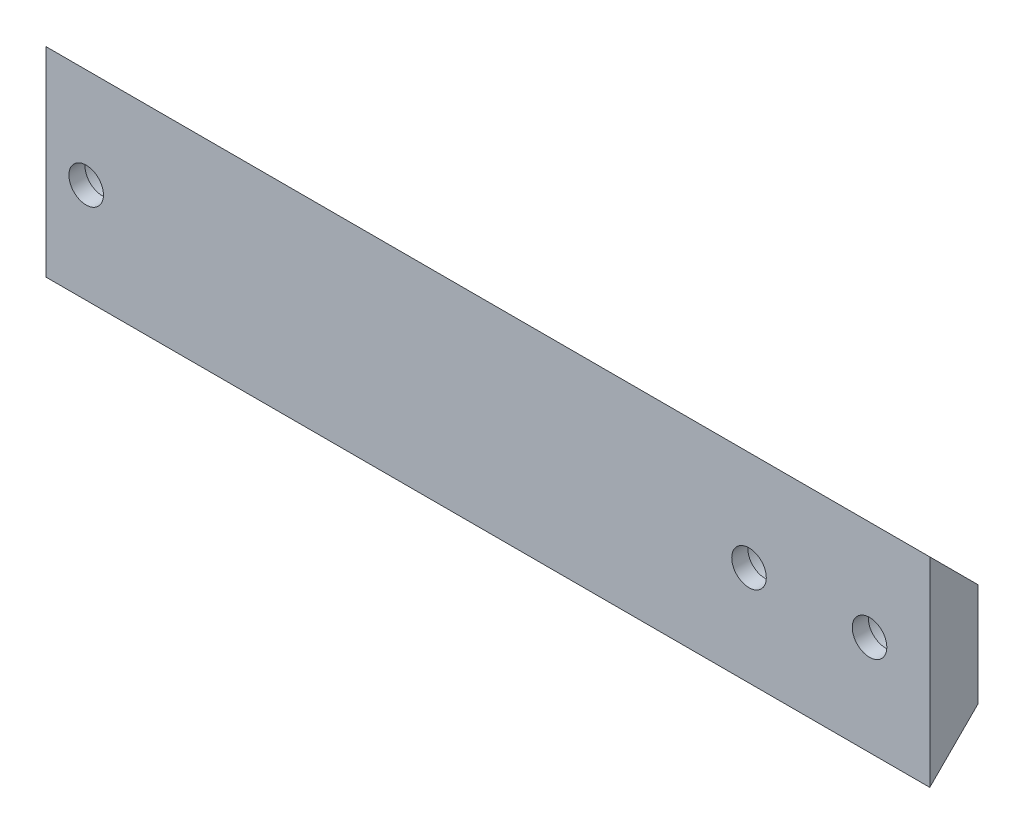
ISO-10303-21;
HEADER;
FILE_DESCRIPTION(('STEP AP214'),'2;1');
FILE_NAME('part.step','',(''),(''),'','','');
FILE_SCHEMA(('AUTOMOTIVE_DESIGN { 1 0 10303 214 1 1 1 1 }'));
ENDSEC;
DATA;
#1=APPLICATION_CONTEXT('core data for automotive mechanical design processes');
#2=APPLICATION_PROTOCOL_DEFINITION('international standard','automotive_design',2000,#1);
#3=PRODUCT_CONTEXT('',#1,'mechanical');
#4=PRODUCT('Part','Part','',(#3));
#5=PRODUCT_RELATED_PRODUCT_CATEGORY('part','',(#4));
#6=PRODUCT_DEFINITION_FORMATION('','',#4);
#7=PRODUCT_DEFINITION_CONTEXT('part definition',#1,'design');
#8=PRODUCT_DEFINITION('design','',#6,#7);
#9=PRODUCT_DEFINITION_SHAPE('','',#8);
#10=(LENGTH_UNIT() NAMED_UNIT(*) SI_UNIT(.MILLI.,.METRE.));
#11=(NAMED_UNIT(*) PLANE_ANGLE_UNIT() SI_UNIT($,.RADIAN.));
#12=(NAMED_UNIT(*) SI_UNIT($,.STERADIAN.) SOLID_ANGLE_UNIT());
#13=UNCERTAINTY_MEASURE_WITH_UNIT(LENGTH_MEASURE(1.E-05),#10,'distance_accuracy_value','');
#14=(GEOMETRIC_REPRESENTATION_CONTEXT(3) GLOBAL_UNCERTAINTY_ASSIGNED_CONTEXT((#13)) GLOBAL_UNIT_ASSIGNED_CONTEXT((#10,
#11,#12)) REPRESENTATION_CONTEXT('',''));
#15=CARTESIAN_POINT('',(0.,0.,0.));
#16=DIRECTION('',(0.,0.,1.));
#17=DIRECTION('',(1.,0.,0.));
#18=AXIS2_PLACEMENT_3D('',#15,#16,#17);
#19=CARTESIAN_POINT('',(0.,0.,0.));
#20=DIRECTION('',(0.,0.,1.));
#21=DIRECTION('',(1.,0.,0.));
#22=AXIS2_PLACEMENT_3D('',#19,#20,#21);
#23=PLANE('',#22);
#24=CARTESIAN_POINT('',(47.5,0.,0.));
#25=DIRECTION('',(0.,0.,-1.));
#26=DIRECTION('',(-1.,0.,0.));
#27=AXIS2_PLACEMENT_3D('',#24,#25,#26);
#28=CIRCLE('',#27,4.);
#29=CARTESIAN_POINT('',(43.5,0.,0.));
#30=VERTEX_POINT('',#29);
#31=EDGE_CURVE('E197',#30,#30,#28,.T.);
#32=ORIENTED_EDGE('',*,*,#31,.F.);
#33=EDGE_LOOP('',(#32));
#34=FACE_BOUND('',#33,.T.);
#35=CARTESIAN_POINT('',(-50.,0.,0.));
#36=DIRECTION('',(0.,0.,-1.));
#37=DIRECTION('',(-1.,0.,0.));
#38=AXIS2_PLACEMENT_3D('',#35,#36,#37);
#39=CIRCLE('',#38,4.);
#40=CARTESIAN_POINT('',(-54.,0.,0.));
#41=VERTEX_POINT('',#40);
#42=EDGE_CURVE('E137',#41,#41,#39,.T.);
#43=ORIENTED_EDGE('',*,*,#42,.F.);
#44=EDGE_LOOP('',(#43));
#45=FACE_BOUND('',#44,.T.);
#46=DIRECTION('',(0.,1.,0.));
#47=VECTOR('',#46,1.);
#48=CARTESIAN_POINT('',(55.,12.425,0.));
#49=LINE('',#48,#47);
#50=CARTESIAN_POINT('',(55.,-6.42499999999997,0.));
#51=VERTEX_POINT('',#50);
#52=CARTESIAN_POINT('',(55.,6.42499999999997,0.));
#53=VERTEX_POINT('',#52);
#54=EDGE_CURVE('E90',#51,#53,#49,.T.);
#55=ORIENTED_EDGE('',*,*,#54,.F.);
#56=DIRECTION('',(-1.,0.,0.));
#57=VECTOR('',#56,1.);
#58=CARTESIAN_POINT('',(0.,-6.42499999999997,0.));
#59=LINE('',#58,#57);
#60=CARTESIAN_POINT('',(-55.,-6.42499999999997,0.));
#61=VERTEX_POINT('',#60);
#62=EDGE_CURVE('E60',#51,#61,#59,.T.);
#63=ORIENTED_EDGE('',*,*,#62,.T.);
#64=DIRECTION('',(0.,-1.,0.));
#65=VECTOR('',#64,1.);
#66=CARTESIAN_POINT('',(-55.,12.425,0.));
#67=LINE('',#66,#65);
#68=CARTESIAN_POINT('',(-55.,6.42499999999997,0.));
#69=VERTEX_POINT('',#68);
#70=EDGE_CURVE('E106',#69,#61,#67,.T.);
#71=ORIENTED_EDGE('',*,*,#70,.F.);
#72=DIRECTION('',(1.,0.,0.));
#73=VECTOR('',#72,1.);
#74=CARTESIAN_POINT('',(0.,6.42499999999997,0.));
#75=LINE('',#74,#73);
#76=EDGE_CURVE('E124',#69,#53,#75,.T.);
#77=ORIENTED_EDGE('',*,*,#76,.T.);
#78=EDGE_LOOP('',(#55,#63,#71,#77));
#79=FACE_BOUND('',#78,.T.);
#80=CARTESIAN_POINT('',(32.5,0.,0.));
#81=DIRECTION('',(0.,0.,-1.));
#82=DIRECTION('',(-1.,0.,0.));
#83=AXIS2_PLACEMENT_3D('',#80,#81,#82);
#84=CIRCLE('',#83,4.);
#85=CARTESIAN_POINT('',(28.5,0.,0.));
#86=VERTEX_POINT('',#85);
#87=EDGE_CURVE('E153',#86,#86,#84,.T.);
#88=ORIENTED_EDGE('',*,*,#87,.F.);
#89=EDGE_LOOP('',(#88));
#90=FACE_BOUND('',#89,.T.);
#91=ADVANCED_FACE('F41',(#34,#45,#79,#90),#23,.F.);
#92=CARTESIAN_POINT('',(55.,12.425,6.));
#93=DIRECTION('',(-1.,0.,0.));
#94=DIRECTION('',(0.,0.,1.));
#95=AXIS2_PLACEMENT_3D('',#92,#93,#94);
#96=PLANE('',#95);
#97=DIRECTION('',(0.,1.,0.));
#98=VECTOR('',#97,1.);
#99=CARTESIAN_POINT('',(55.,12.425,6.));
#100=LINE('',#99,#98);
#101=CARTESIAN_POINT('',(55.,-12.425,6.));
#102=VERTEX_POINT('',#101);
#103=CARTESIAN_POINT('',(55.,12.425,6.));
#104=VERTEX_POINT('',#103);
#105=EDGE_CURVE('E89',#102,#104,#100,.T.);
#106=ORIENTED_EDGE('',*,*,#105,.F.);
#107=DIRECTION('',(0.,-0.707106781186549,0.707106781186546));
#108=VECTOR('',#107,1.);
#109=CARTESIAN_POINT('',(55.,-12.425,6.));
#110=LINE('',#109,#108);
#111=EDGE_CURVE('E95',#102,#51,#110,.F.);
#112=ORIENTED_EDGE('',*,*,#111,.T.);
#113=ORIENTED_EDGE('',*,*,#54,.T.);
#114=DIRECTION('',(0.,-0.707106781186549,-0.707106781186546));
#115=VECTOR('',#114,1.);
#116=CARTESIAN_POINT('',(55.,12.425,6.));
#117=LINE('',#116,#115);
#118=EDGE_CURVE('E86',#53,#104,#117,.F.);
#119=ORIENTED_EDGE('',*,*,#118,.T.);
#120=EDGE_LOOP('',(#106,#112,#113,#119));
#121=FACE_BOUND('',#120,.T.);
#122=ADVANCED_FACE('F88',(#121),#96,.F.);
#123=CARTESIAN_POINT('',(-55.,12.425,6.));
#124=DIRECTION('',(1.,0.,0.));
#125=DIRECTION('',(0.,0.,-1.));
#126=AXIS2_PLACEMENT_3D('',#123,#124,#125);
#127=PLANE('',#126);
#128=ORIENTED_EDGE('',*,*,#70,.T.);
#129=DIRECTION('',(0.,0.707106781186549,-0.707106781186546));
#130=VECTOR('',#129,1.);
#131=CARTESIAN_POINT('',(-55.,-12.425,6.));
#132=LINE('',#131,#130);
#133=CARTESIAN_POINT('',(-55.,-12.425,6.));
#134=VERTEX_POINT('',#133);
#135=EDGE_CURVE('E11',#61,#134,#132,.F.);
#136=ORIENTED_EDGE('',*,*,#135,.T.);
#137=DIRECTION('',(0.,-1.,0.));
#138=VECTOR('',#137,1.);
#139=CARTESIAN_POINT('',(-55.,12.425,6.));
#140=LINE('',#139,#138);
#141=CARTESIAN_POINT('',(-55.,12.425,6.));
#142=VERTEX_POINT('',#141);
#143=EDGE_CURVE('E109',#142,#134,#140,.T.);
#144=ORIENTED_EDGE('',*,*,#143,.F.);
#145=DIRECTION('',(0.,0.707106781186549,0.707106781186546));
#146=VECTOR('',#145,1.);
#147=CARTESIAN_POINT('',(-55.,12.425,6.));
#148=LINE('',#147,#146);
#149=EDGE_CURVE('E52',#142,#69,#148,.F.);
#150=ORIENTED_EDGE('',*,*,#149,.T.);
#151=EDGE_LOOP('',(#128,#136,#144,#150));
#152=FACE_BOUND('',#151,.T.);
#153=ADVANCED_FACE('F233',(#152),#127,.F.);
#154=CARTESIAN_POINT('',(0.,0.,6.));
#155=DIRECTION('',(0.,0.,1.));
#156=DIRECTION('',(1.,0.,0.));
#157=AXIS2_PLACEMENT_3D('',#154,#155,#156);
#158=PLANE('',#157);
#159=CARTESIAN_POINT('',(47.5,0.,6.));
#160=DIRECTION('',(0.,0.,1.));
#161=DIRECTION('',(1.,0.,0.));
#162=AXIS2_PLACEMENT_3D('',#159,#160,#161);
#163=CIRCLE('',#162,2.15);
#164=CARTESIAN_POINT('',(49.65,0.,6.));
#165=VERTEX_POINT('',#164);
#166=EDGE_CURVE('E46',#165,#165,#163,.T.);
#167=ORIENTED_EDGE('',*,*,#166,.F.);
#168=EDGE_LOOP('',(#167));
#169=FACE_BOUND('',#168,.T.);
#170=CARTESIAN_POINT('',(32.5,0.,6.));
#171=DIRECTION('',(0.,0.,1.));
#172=DIRECTION('',(1.,0.,0.));
#173=AXIS2_PLACEMENT_3D('',#170,#171,#172);
#174=CIRCLE('',#173,2.15);
#175=CARTESIAN_POINT('',(34.65,0.,6.));
#176=VERTEX_POINT('',#175);
#177=EDGE_CURVE('E134',#176,#176,#174,.T.);
#178=ORIENTED_EDGE('',*,*,#177,.F.);
#179=EDGE_LOOP('',(#178));
#180=FACE_BOUND('',#179,.T.);
#181=CARTESIAN_POINT('',(-50.,0.,6.));
#182=DIRECTION('',(0.,0.,1.));
#183=DIRECTION('',(1.,0.,0.));
#184=AXIS2_PLACEMENT_3D('',#181,#182,#183);
#185=CIRCLE('',#184,2.15);
#186=CARTESIAN_POINT('',(-47.85,0.,6.));
#187=VERTEX_POINT('',#186);
#188=EDGE_CURVE('E119',#187,#187,#185,.T.);
#189=ORIENTED_EDGE('',*,*,#188,.F.);
#190=EDGE_LOOP('',(#189));
#191=FACE_BOUND('',#190,.T.);
#192=ORIENTED_EDGE('',*,*,#105,.T.);
#193=DIRECTION('',(-1.,0.,0.));
#194=VECTOR('',#193,1.);
#195=CARTESIAN_POINT('',(-55.,12.425,6.));
#196=LINE('',#195,#194);
#197=EDGE_CURVE('E103',#104,#142,#196,.T.);
#198=ORIENTED_EDGE('',*,*,#197,.T.);
#199=ORIENTED_EDGE('',*,*,#143,.T.);
#200=DIRECTION('',(1.,0.,0.));
#201=VECTOR('',#200,1.);
#202=CARTESIAN_POINT('',(-55.,-12.425,6.));
#203=LINE('',#202,#201);
#204=EDGE_CURVE('E96',#134,#102,#203,.T.);
#205=ORIENTED_EDGE('',*,*,#204,.T.);
#206=EDGE_LOOP('',(#192,#198,#199,#205));
#207=FACE_BOUND('',#206,.T.);
#208=ADVANCED_FACE('F101',(#169,#180,#191,#207),#158,.T.);
#209=CARTESIAN_POINT('',(-55.,-12.425,6.));
#210=DIRECTION('',(0.,0.707106781186546,0.707106781186549));
#211=DIRECTION('',(1.,0.,0.));
#212=AXIS2_PLACEMENT_3D('',#209,#210,#211);
#213=PLANE('',#212);
#214=ORIENTED_EDGE('',*,*,#135,.F.);
#215=ORIENTED_EDGE('',*,*,#62,.F.);
#216=ORIENTED_EDGE('',*,*,#111,.F.);
#217=ORIENTED_EDGE('',*,*,#204,.F.);
#218=EDGE_LOOP('',(#214,#215,#216,#217));
#219=FACE_BOUND('',#218,.T.);
#220=ADVANCED_FACE('F232',(#219),#213,.F.);
#221=CARTESIAN_POINT('',(-55.,12.425,6.));
#222=DIRECTION('',(0.,-0.707106781186546,0.707106781186549));
#223=DIRECTION('',(-1.,0.,0.));
#224=AXIS2_PLACEMENT_3D('',#221,#222,#223);
#225=PLANE('',#224);
#226=ORIENTED_EDGE('',*,*,#118,.F.);
#227=ORIENTED_EDGE('',*,*,#76,.F.);
#228=ORIENTED_EDGE('',*,*,#149,.F.);
#229=ORIENTED_EDGE('',*,*,#197,.F.);
#230=EDGE_LOOP('',(#226,#227,#228,#229));
#231=FACE_BOUND('',#230,.T.);
#232=ADVANCED_FACE('F44',(#231),#225,.F.);
#233=CARTESIAN_POINT('',(-50.,0.,0.));
#234=DIRECTION('',(0.,0.,-1.));
#235=DIRECTION('',(-1.,0.,0.));
#236=AXIS2_PLACEMENT_3D('',#233,#234,#235);
#237=CYLINDRICAL_SURFACE('',#236,2.15);
#238=ORIENTED_EDGE('',*,*,#188,.T.);
#239=EDGE_LOOP('',(#238));
#240=FACE_BOUND('',#239,.T.);
#241=CARTESIAN_POINT('',(-50.,0.,4.));
#242=DIRECTION('',(0.,0.,-1.));
#243=DIRECTION('',(-1.,0.,0.));
#244=AXIS2_PLACEMENT_3D('',#241,#242,#243);
#245=CIRCLE('',#244,2.15);
#246=CARTESIAN_POINT('',(-52.15,0.,4.));
#247=VERTEX_POINT('',#246);
#248=EDGE_CURVE('E133',#247,#247,#245,.T.);
#249=ORIENTED_EDGE('',*,*,#248,.T.);
#250=EDGE_LOOP('',(#249));
#251=FACE_BOUND('',#250,.T.);
#252=ADVANCED_FACE('F163',(#240,#251),#237,.F.);
#253=CARTESIAN_POINT('',(-47.85,0.,4.));
#254=DIRECTION('',(0.,0.,1.));
#255=DIRECTION('',(1.,0.,0.));
#256=AXIS2_PLACEMENT_3D('',#253,#254,#255);
#257=PLANE('',#256);
#258=ORIENTED_EDGE('',*,*,#248,.F.);
#259=EDGE_LOOP('',(#258));
#260=FACE_BOUND('',#259,.T.);
#261=CARTESIAN_POINT('',(-50.,0.,4.));
#262=DIRECTION('',(0.,0.,-1.));
#263=DIRECTION('',(-1.,0.,0.));
#264=AXIS2_PLACEMENT_3D('',#261,#262,#263);
#265=CIRCLE('',#264,4.);
#266=CARTESIAN_POINT('',(-54.,0.,4.));
#267=VERTEX_POINT('',#266);
#268=EDGE_CURVE('E144',#267,#267,#265,.T.);
#269=ORIENTED_EDGE('',*,*,#268,.T.);
#270=EDGE_LOOP('',(#269));
#271=FACE_BOUND('',#270,.T.);
#272=ADVANCED_FACE('F165',(#260,#271),#257,.F.);
#273=CARTESIAN_POINT('',(-50.,0.,0.));
#274=DIRECTION('',(0.,0.,-1.));
#275=DIRECTION('',(-1.,0.,0.));
#276=AXIS2_PLACEMENT_3D('',#273,#274,#275);
#277=CYLINDRICAL_SURFACE('',#276,4.);
#278=ORIENTED_EDGE('',*,*,#268,.F.);
#279=EDGE_LOOP('',(#278));
#280=FACE_BOUND('',#279,.T.);
#281=ORIENTED_EDGE('',*,*,#42,.T.);
#282=EDGE_LOOP('',(#281));
#283=FACE_BOUND('',#282,.T.);
#284=ADVANCED_FACE('F168',(#280,#283),#277,.F.);
#285=CARTESIAN_POINT('',(32.5,0.,0.));
#286=DIRECTION('',(0.,0.,-1.));
#287=DIRECTION('',(-1.,0.,0.));
#288=AXIS2_PLACEMENT_3D('',#285,#286,#287);
#289=CYLINDRICAL_SURFACE('',#288,2.15);
#290=ORIENTED_EDGE('',*,*,#177,.T.);
#291=EDGE_LOOP('',(#290));
#292=FACE_BOUND('',#291,.T.);
#293=CARTESIAN_POINT('',(32.5,0.,4.));
#294=DIRECTION('',(0.,0.,-1.));
#295=DIRECTION('',(-1.,0.,0.));
#296=AXIS2_PLACEMENT_3D('',#293,#294,#295);
#297=CIRCLE('',#296,2.15);
#298=CARTESIAN_POINT('',(30.35,0.,4.));
#299=VERTEX_POINT('',#298);
#300=EDGE_CURVE('E138',#299,#299,#297,.T.);
#301=ORIENTED_EDGE('',*,*,#300,.T.);
#302=EDGE_LOOP('',(#301));
#303=FACE_BOUND('',#302,.T.);
#304=ADVANCED_FACE('F174',(#292,#303),#289,.F.);
#305=CARTESIAN_POINT('',(34.65,0.,4.));
#306=DIRECTION('',(0.,0.,1.));
#307=DIRECTION('',(1.,0.,0.));
#308=AXIS2_PLACEMENT_3D('',#305,#306,#307);
#309=PLANE('',#308);
#310=ORIENTED_EDGE('',*,*,#300,.F.);
#311=EDGE_LOOP('',(#310));
#312=FACE_BOUND('',#311,.T.);
#313=CARTESIAN_POINT('',(32.5,0.,4.));
#314=DIRECTION('',(0.,0.,-1.));
#315=DIRECTION('',(-1.,0.,0.));
#316=AXIS2_PLACEMENT_3D('',#313,#314,#315);
#317=CIRCLE('',#316,4.);
#318=CARTESIAN_POINT('',(28.5,0.,4.));
#319=VERTEX_POINT('',#318);
#320=EDGE_CURVE('E147',#319,#319,#317,.T.);
#321=ORIENTED_EDGE('',*,*,#320,.T.);
#322=EDGE_LOOP('',(#321));
#323=FACE_BOUND('',#322,.T.);
#324=ADVANCED_FACE('F221',(#312,#323),#309,.F.);
#325=CARTESIAN_POINT('',(32.5,0.,0.));
#326=DIRECTION('',(0.,0.,-1.));
#327=DIRECTION('',(-1.,0.,0.));
#328=AXIS2_PLACEMENT_3D('',#325,#326,#327);
#329=CYLINDRICAL_SURFACE('',#328,4.);
#330=ORIENTED_EDGE('',*,*,#320,.F.);
#331=EDGE_LOOP('',(#330));
#332=FACE_BOUND('',#331,.T.);
#333=ORIENTED_EDGE('',*,*,#87,.T.);
#334=EDGE_LOOP('',(#333));
#335=FACE_BOUND('',#334,.T.);
#336=ADVANCED_FACE('F217',(#332,#335),#329,.F.);
#337=CARTESIAN_POINT('',(47.5,0.,0.));
#338=DIRECTION('',(0.,0.,-1.));
#339=DIRECTION('',(-1.,0.,0.));
#340=AXIS2_PLACEMENT_3D('',#337,#338,#339);
#341=CYLINDRICAL_SURFACE('',#340,2.15);
#342=ORIENTED_EDGE('',*,*,#166,.T.);
#343=EDGE_LOOP('',(#342));
#344=FACE_BOUND('',#343,.T.);
#345=CARTESIAN_POINT('',(47.5,0.,4.));
#346=DIRECTION('',(0.,0.,-1.));
#347=DIRECTION('',(-1.,0.,0.));
#348=AXIS2_PLACEMENT_3D('',#345,#346,#347);
#349=CIRCLE('',#348,2.15);
#350=CARTESIAN_POINT('',(45.35,0.,4.));
#351=VERTEX_POINT('',#350);
#352=EDGE_CURVE('E188',#351,#351,#349,.T.);
#353=ORIENTED_EDGE('',*,*,#352,.T.);
#354=EDGE_LOOP('',(#353));
#355=FACE_BOUND('',#354,.T.);
#356=ADVANCED_FACE('F210',(#344,#355),#341,.F.);
#357=CARTESIAN_POINT('',(49.65,0.,4.));
#358=DIRECTION('',(0.,0.,1.));
#359=DIRECTION('',(1.,0.,0.));
#360=AXIS2_PLACEMENT_3D('',#357,#358,#359);
#361=PLANE('',#360);
#362=ORIENTED_EDGE('',*,*,#352,.F.);
#363=EDGE_LOOP('',(#362));
#364=FACE_BOUND('',#363,.T.);
#365=CARTESIAN_POINT('',(47.5,0.,4.));
#366=DIRECTION('',(0.,0.,-1.));
#367=DIRECTION('',(-1.,0.,0.));
#368=AXIS2_PLACEMENT_3D('',#365,#366,#367);
#369=CIRCLE('',#368,4.);
#370=CARTESIAN_POINT('',(43.5,0.,4.));
#371=VERTEX_POINT('',#370);
#372=EDGE_CURVE('E193',#371,#371,#369,.T.);
#373=ORIENTED_EDGE('',*,*,#372,.T.);
#374=EDGE_LOOP('',(#373));
#375=FACE_BOUND('',#374,.T.);
#376=ADVANCED_FACE('F204',(#364,#375),#361,.F.);
#377=CARTESIAN_POINT('',(47.5,0.,0.));
#378=DIRECTION('',(0.,0.,-1.));
#379=DIRECTION('',(-1.,0.,0.));
#380=AXIS2_PLACEMENT_3D('',#377,#378,#379);
#381=CYLINDRICAL_SURFACE('',#380,4.);
#382=ORIENTED_EDGE('',*,*,#372,.F.);
#383=EDGE_LOOP('',(#382));
#384=FACE_BOUND('',#383,.T.);
#385=ORIENTED_EDGE('',*,*,#31,.T.);
#386=EDGE_LOOP('',(#385));
#387=FACE_BOUND('',#386,.T.);
#388=ADVANCED_FACE('F202',(#384,#387),#381,.F.);
#389=CLOSED_SHELL('',(#91,#122,#153,#208,#220,#232,#252,#272,#284,#304,#324,#336,#356,#376,#388));
#390=MANIFOLD_SOLID_BREP('B2',#389);
#391=ADVANCED_BREP_SHAPE_REPRESENTATION('',(#18,#390),#14);
#392=SHAPE_DEFINITION_REPRESENTATION(#9,#391);
ENDSEC;
END-ISO-10303-21;
